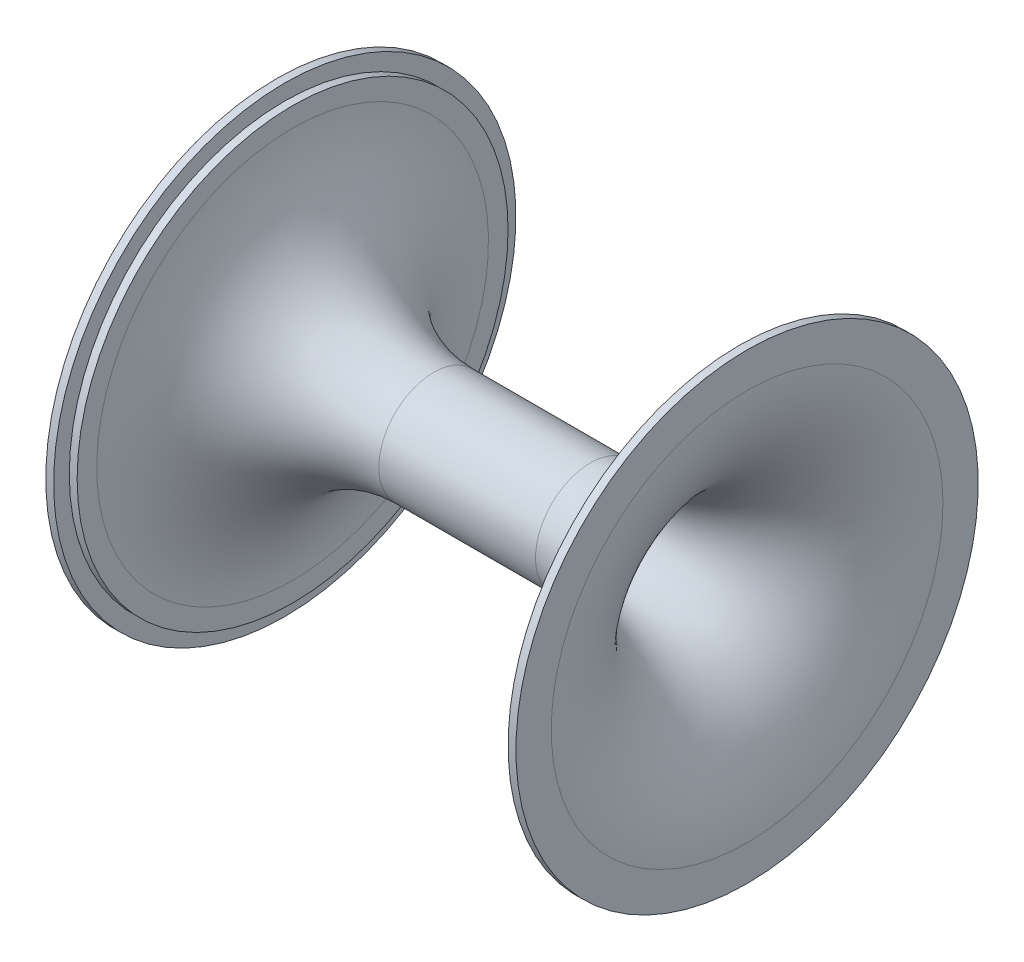
ISO-10303-21;
HEADER;
FILE_DESCRIPTION(('STEP AP214'),'2;1');
FILE_NAME('part.step','',(''),(''),'','','');
FILE_SCHEMA(('AUTOMOTIVE_DESIGN { 1 0 10303 214 1 1 1 1 }'));
ENDSEC;
DATA;
#1=APPLICATION_CONTEXT('core data for automotive mechanical design processes');
#2=APPLICATION_PROTOCOL_DEFINITION('international standard','automotive_design',2000,#1);
#3=PRODUCT_CONTEXT('',#1,'mechanical');
#4=PRODUCT('Part','Part','',(#3));
#5=PRODUCT_RELATED_PRODUCT_CATEGORY('part','',(#4));
#6=PRODUCT_DEFINITION_FORMATION('','',#4);
#7=PRODUCT_DEFINITION_CONTEXT('part definition',#1,'design');
#8=PRODUCT_DEFINITION('design','',#6,#7);
#9=PRODUCT_DEFINITION_SHAPE('','',#8);
#10=(LENGTH_UNIT() NAMED_UNIT(*) SI_UNIT(.MILLI.,.METRE.));
#11=(NAMED_UNIT(*) PLANE_ANGLE_UNIT() SI_UNIT($,.RADIAN.));
#12=(NAMED_UNIT(*) SI_UNIT($,.STERADIAN.) SOLID_ANGLE_UNIT());
#13=UNCERTAINTY_MEASURE_WITH_UNIT(LENGTH_MEASURE(1.E-05),#10,'distance_accuracy_value','');
#14=(GEOMETRIC_REPRESENTATION_CONTEXT(3) GLOBAL_UNCERTAINTY_ASSIGNED_CONTEXT((#13)) GLOBAL_UNIT_ASSIGNED_CONTEXT((#10,
#11,#12)) REPRESENTATION_CONTEXT('',''));
#15=CARTESIAN_POINT('',(0.,0.,0.));
#16=DIRECTION('',(0.,0.,1.));
#17=DIRECTION('',(1.,0.,0.));
#18=AXIS2_PLACEMENT_3D('',#15,#16,#17);
#19=CARTESIAN_POINT('',(-103.792378726126,96.9392817679558,0.));
#20=DIRECTION('',(-1.,0.,0.));
#21=DIRECTION('',(0.,-1.,0.));
#22=AXIS2_PLACEMENT_3D('',#19,#20,#21);
#23=CYLINDRICAL_SURFACE('',#22,55.);
#24=CARTESIAN_POINT('',(-101.792378726126,96.9392817679558,0.));
#25=DIRECTION('',(1.,0.,0.));
#26=DIRECTION('',(0.,0.,-1.));
#27=AXIS2_PLACEMENT_3D('',#24,#25,#26);
#28=CIRCLE('',#27,55.);
#29=CARTESIAN_POINT('',(-101.792378726126,151.939281767956,0.));
#30=VERTEX_POINT('',#29);
#31=EDGE_CURVE('E11',#30,#30,#28,.F.);
#32=ORIENTED_EDGE('',*,*,#31,.F.);
#33=EDGE_LOOP('',(#32));
#34=FACE_BOUND('',#33,.T.);
#35=CARTESIAN_POINT('',(-99.7923787261258,96.9392817679558,0.));
#36=DIRECTION('',(1.,0.,0.));
#37=DIRECTION('',(0.,1.,0.));
#38=AXIS2_PLACEMENT_3D('',#35,#36,#37);
#39=CIRCLE('',#38,55.);
#40=CARTESIAN_POINT('',(-99.7923787261258,151.939281767956,0.));
#41=VERTEX_POINT('',#40);
#42=EDGE_CURVE('E113',#41,#41,#39,.T.);
#43=ORIENTED_EDGE('',*,*,#42,.F.);
#44=EDGE_LOOP('',(#43));
#45=FACE_BOUND('',#44,.T.);
#46=ADVANCED_FACE('F43',(#34,#45),#23,.T.);
#47=CARTESIAN_POINT('',(14.2076212738741,96.9392817679558,0.));
#48=DIRECTION('',(-1.,0.,0.));
#49=DIRECTION('',(0.,0.,1.));
#50=AXIS2_PLACEMENT_3D('',#47,#48,#49);
#51=CIRCLE('',#50,55.);
#52=CARTESIAN_POINT('',(14.2076212738741,151.939281767956,0.));
#53=VERTEX_POINT('',#52);
#54=EDGE_CURVE('E51',#53,#53,#51,.F.);
#55=ORIENTED_EDGE('',*,*,#54,.F.);
#56=EDGE_LOOP('',(#55));
#57=FACE_BOUND('',#56,.T.);
#58=CARTESIAN_POINT('',(12.2076212738741,96.9392817679558,0.));
#59=DIRECTION('',(1.,0.,0.));
#60=DIRECTION('',(0.,0.,-1.));
#61=AXIS2_PLACEMENT_3D('',#58,#59,#60);
#62=CIRCLE('',#61,55.);
#63=CARTESIAN_POINT('',(12.2076212738741,96.9392817679558,-55.));
#64=VERTEX_POINT('',#63);
#65=EDGE_CURVE('E106',#64,#64,#62,.T.);
#66=ORIENTED_EDGE('',*,*,#65,.T.);
#67=EDGE_LOOP('',(#66));
#68=FACE_BOUND('',#67,.T.);
#69=ADVANCED_FACE('F143',(#57,#68),#23,.T.);
#70=CARTESIAN_POINT('',(-99.7923787261258,156.939281767956,150.));
#71=DIRECTION('',(1.,0.,0.));
#72=DIRECTION('',(0.,1.,0.));
#73=AXIS2_PLACEMENT_3D('',#70,#71,#72);
#74=PLANE('',#73);
#75=CARTESIAN_POINT('',(-99.7923787261258,96.9392817679558,0.));
#76=DIRECTION('',(1.,0.,0.));
#77=DIRECTION('',(0.,1.,0.));
#78=AXIS2_PLACEMENT_3D('',#75,#76,#77);
#79=CIRCLE('',#78,50.);
#80=CARTESIAN_POINT('',(-99.7923787261258,146.939281767956,0.));
#81=VERTEX_POINT('',#80);
#82=EDGE_CURVE('E122',#81,#81,#79,.T.);
#83=ORIENTED_EDGE('',*,*,#82,.F.);
#84=EDGE_LOOP('',(#83));
#85=FACE_BOUND('',#84,.T.);
#86=ORIENTED_EDGE('',*,*,#42,.T.);
#87=EDGE_LOOP('',(#86));
#88=FACE_BOUND('',#87,.T.);
#89=ADVANCED_FACE('F146',(#85,#88),#74,.T.);
#90=CARTESIAN_POINT('',(12.2076212738741,156.939281767956,150.));
#91=DIRECTION('',(1.,0.,0.));
#92=DIRECTION('',(0.,0.,-1.));
#93=AXIS2_PLACEMENT_3D('',#90,#91,#92);
#94=PLANE('',#93);
#95=CARTESIAN_POINT('',(12.2076212738741,96.9392817679558,0.));
#96=DIRECTION('',(1.,0.,0.));
#97=DIRECTION('',(0.,0.,-1.));
#98=AXIS2_PLACEMENT_3D('',#95,#96,#97);
#99=CIRCLE('',#98,50.);
#100=CARTESIAN_POINT('',(12.2076212738741,96.9392817679558,-50.));
#101=VERTEX_POINT('',#100);
#102=EDGE_CURVE('E125',#101,#101,#99,.F.);
#103=ORIENTED_EDGE('',*,*,#102,.F.);
#104=EDGE_LOOP('',(#103));
#105=FACE_BOUND('',#104,.T.);
#106=ORIENTED_EDGE('',*,*,#65,.F.);
#107=EDGE_LOOP('',(#106));
#108=FACE_BOUND('',#107,.T.);
#109=ADVANCED_FACE('F151',(#105,#108),#94,.F.);
#110=CARTESIAN_POINT('',(-63.7923787261258,96.9392817679558,0.));
#111=DIRECTION('',(-1.,0.,0.));
#112=DIRECTION('',(0.,0.,1.));
#113=AXIS2_PLACEMENT_3D('',#110,#111,#112);
#114=CYLINDRICAL_SURFACE('',#113,14.);
#115=CARTESIAN_POINT('',(-23.7923787261259,96.9392817679558,0.));
#116=DIRECTION('',(1.,0.,0.));
#117=DIRECTION('',(0.,0.,-1.));
#118=AXIS2_PLACEMENT_3D('',#115,#116,#117);
#119=CIRCLE('',#118,14.);
#120=CARTESIAN_POINT('',(-23.7923787261259,96.9392817679558,-14.));
#121=VERTEX_POINT('',#120);
#122=EDGE_CURVE('E128',#121,#121,#119,.T.);
#123=ORIENTED_EDGE('',*,*,#122,.F.);
#124=EDGE_LOOP('',(#123));
#125=FACE_BOUND('',#124,.T.);
#126=CARTESIAN_POINT('',(-63.7923787261258,96.9392817679558,0.));
#127=DIRECTION('',(1.,0.,0.));
#128=DIRECTION('',(0.,1.,0.));
#129=AXIS2_PLACEMENT_3D('',#126,#127,#128);
#130=CIRCLE('',#129,14.);
#131=CARTESIAN_POINT('',(-63.7923787261258,110.939281767956,0.));
#132=VERTEX_POINT('',#131);
#133=EDGE_CURVE('E131',#132,#132,#130,.F.);
#134=ORIENTED_EDGE('',*,*,#133,.F.);
#135=EDGE_LOOP('',(#134));
#136=FACE_BOUND('',#135,.T.);
#137=ADVANCED_FACE('F153',(#125,#136),#114,.T.);
#138=CARTESIAN_POINT('',(-23.7923787261259,96.9392817679558,0.));
#139=DIRECTION('',(1.,0.,0.));
#140=DIRECTION('',(0.,0.,-1.));
#141=AXIS2_PLACEMENT_3D('',#138,#139,#140);
#142=TOROIDAL_SURFACE('',#141,50.,36.);
#143=ORIENTED_EDGE('',*,*,#102,.T.);
#144=EDGE_LOOP('',(#143));
#145=FACE_BOUND('',#144,.T.);
#146=ORIENTED_EDGE('',*,*,#122,.T.);
#147=EDGE_LOOP('',(#146));
#148=FACE_BOUND('',#147,.T.);
#149=ADVANCED_FACE('F160',(#145,#148),#142,.F.);
#150=CARTESIAN_POINT('',(-63.7923787261258,96.9392817679558,0.));
#151=DIRECTION('',(1.,0.,0.));
#152=DIRECTION('',(0.,1.,0.));
#153=AXIS2_PLACEMENT_3D('',#150,#151,#152);
#154=TOROIDAL_SURFACE('',#153,50.,36.);
#155=ORIENTED_EDGE('',*,*,#82,.T.);
#156=EDGE_LOOP('',(#155));
#157=FACE_BOUND('',#156,.T.);
#158=ORIENTED_EDGE('',*,*,#133,.T.);
#159=EDGE_LOOP('',(#158));
#160=FACE_BOUND('',#159,.T.);
#161=ADVANCED_FACE('F207',(#157,#160),#154,.F.);
#162=CARTESIAN_POINT('',(-63.7923787261258,96.9392817679558,0.));
#163=DIRECTION('',(-1.,0.,0.));
#164=DIRECTION('',(0.,0.,1.));
#165=AXIS2_PLACEMENT_3D('',#162,#163,#164);
#166=CYLINDRICAL_SURFACE('',#165,10.);
#167=CARTESIAN_POINT('',(-63.7923787261258,96.9392817679558,0.));
#168=DIRECTION('',(1.,0.,0.));
#169=DIRECTION('',(0.,1.,0.));
#170=AXIS2_PLACEMENT_3D('',#167,#168,#169);
#171=CIRCLE('',#170,10.);
#172=CARTESIAN_POINT('',(-63.7923787261258,106.939281767956,0.));
#173=VERTEX_POINT('',#172);
#174=EDGE_CURVE('E112',#173,#173,#171,.F.);
#175=ORIENTED_EDGE('',*,*,#174,.T.);
#176=EDGE_LOOP('',(#175));
#177=FACE_BOUND('',#176,.T.);
#178=CARTESIAN_POINT('',(-23.7923787261259,96.9392817679558,0.));
#179=DIRECTION('',(1.,0.,0.));
#180=DIRECTION('',(0.,0.,-1.));
#181=AXIS2_PLACEMENT_3D('',#178,#179,#180);
#182=CIRCLE('',#181,10.);
#183=CARTESIAN_POINT('',(-23.7923787261259,96.9392817679558,-10.));
#184=VERTEX_POINT('',#183);
#185=EDGE_CURVE('E116',#184,#184,#182,.T.);
#186=ORIENTED_EDGE('',*,*,#185,.T.);
#187=EDGE_LOOP('',(#186));
#188=FACE_BOUND('',#187,.T.);
#189=ADVANCED_FACE('F202',(#177,#188),#166,.F.);
#190=CARTESIAN_POINT('',(-23.7923787261259,96.9392817679558,0.));
#191=DIRECTION('',(1.,0.,0.));
#192=DIRECTION('',(0.,0.,-1.));
#193=AXIS2_PLACEMENT_3D('',#190,#191,#192);
#194=TOROIDAL_SURFACE('',#193,50.,40.);
#195=CARTESIAN_POINT('',(16.2076212738741,96.9392817679558,0.));
#196=DIRECTION('',(1.,0.,0.));
#197=DIRECTION('',(0.,0.,-1.));
#198=AXIS2_PLACEMENT_3D('',#195,#196,#197);
#199=CIRCLE('',#198,50.);
#200=CARTESIAN_POINT('',(16.2076212738741,96.9392817679558,-50.));
#201=VERTEX_POINT('',#200);
#202=EDGE_CURVE('E109',#201,#201,#199,.F.);
#203=ORIENTED_EDGE('',*,*,#202,.F.);
#204=EDGE_LOOP('',(#203));
#205=FACE_BOUND('',#204,.T.);
#206=ORIENTED_EDGE('',*,*,#185,.F.);
#207=EDGE_LOOP('',(#206));
#208=FACE_BOUND('',#207,.T.);
#209=ADVANCED_FACE('F200',(#205,#208),#194,.T.);
#210=CARTESIAN_POINT('',(16.2076212738741,156.939281767956,150.));
#211=DIRECTION('',(1.,0.,0.));
#212=DIRECTION('',(0.,0.,-1.));
#213=AXIS2_PLACEMENT_3D('',#210,#211,#212);
#214=PLANE('',#213);
#215=ORIENTED_EDGE('',*,*,#202,.T.);
#216=EDGE_LOOP('',(#215));
#217=FACE_BOUND('',#216,.T.);
#218=CARTESIAN_POINT('',(16.2076212738741,96.9392817679558,0.));
#219=DIRECTION('',(1.,0.,0.));
#220=DIRECTION('',(0.,1.,0.));
#221=AXIS2_PLACEMENT_3D('',#218,#219,#220);
#222=CIRCLE('',#221,59.);
#223=CARTESIAN_POINT('',(16.2076212738741,155.939281767956,0.));
#224=VERTEX_POINT('',#223);
#225=EDGE_CURVE('E60',#224,#224,#222,.T.);
#226=ORIENTED_EDGE('',*,*,#225,.T.);
#227=EDGE_LOOP('',(#226));
#228=FACE_BOUND('',#227,.T.);
#229=ADVANCED_FACE('F45',(#217,#228),#214,.T.);
#230=CARTESIAN_POINT('',(-63.7923787261258,96.9392817679558,0.));
#231=DIRECTION('',(1.,0.,0.));
#232=DIRECTION('',(0.,1.,0.));
#233=AXIS2_PLACEMENT_3D('',#230,#231,#232);
#234=TOROIDAL_SURFACE('',#233,50.,40.);
#235=CARTESIAN_POINT('',(-103.792378726126,96.9392817679558,0.));
#236=DIRECTION('',(1.,0.,0.));
#237=DIRECTION('',(0.,1.,0.));
#238=AXIS2_PLACEMENT_3D('',#235,#236,#237);
#239=CIRCLE('',#238,50.);
#240=CARTESIAN_POINT('',(-103.792378726126,146.939281767956,0.));
#241=VERTEX_POINT('',#240);
#242=EDGE_CURVE('E119',#241,#241,#239,.T.);
#243=ORIENTED_EDGE('',*,*,#242,.F.);
#244=EDGE_LOOP('',(#243));
#245=FACE_BOUND('',#244,.T.);
#246=ORIENTED_EDGE('',*,*,#174,.F.);
#247=EDGE_LOOP('',(#246));
#248=FACE_BOUND('',#247,.T.);
#249=ADVANCED_FACE('F169',(#245,#248),#234,.T.);
#250=CARTESIAN_POINT('',(-103.792378726126,156.939281767956,150.));
#251=DIRECTION('',(1.,0.,0.));
#252=DIRECTION('',(0.,1.,0.));
#253=AXIS2_PLACEMENT_3D('',#250,#251,#252);
#254=PLANE('',#253);
#255=ORIENTED_EDGE('',*,*,#242,.T.);
#256=EDGE_LOOP('',(#255));
#257=FACE_BOUND('',#256,.T.);
#258=CARTESIAN_POINT('',(-103.792378726126,96.9392817679558,0.));
#259=DIRECTION('',(1.,0.,0.));
#260=DIRECTION('',(0.,1.,0.));
#261=AXIS2_PLACEMENT_3D('',#258,#259,#260);
#262=CIRCLE('',#261,59.);
#263=CARTESIAN_POINT('',(-103.792378726126,155.939281767956,0.));
#264=VERTEX_POINT('',#263);
#265=EDGE_CURVE('E82',#264,#264,#262,.T.);
#266=ORIENTED_EDGE('',*,*,#265,.F.);
#267=EDGE_LOOP('',(#266));
#268=FACE_BOUND('',#267,.T.);
#269=ADVANCED_FACE('F167',(#257,#268),#254,.F.);
#270=CARTESIAN_POINT('',(16.2076212738741,96.9392817679558,0.));
#271=DIRECTION('',(1.,0.,0.));
#272=DIRECTION('',(0.,0.,-1.));
#273=AXIS2_PLACEMENT_3D('',#270,#271,#272);
#274=CYLINDRICAL_SURFACE('',#273,59.);
#275=DIRECTION('',(-1.,0.,0.));
#276=VECTOR('',#275,1.);
#277=CARTESIAN_POINT('',(14.2076212738741,155.939281767956,0.));
#278=LINE('',#277,#276);
#279=CARTESIAN_POINT('',(14.2076212738741,155.939281767956,0.));
#280=VERTEX_POINT('',#279);
#281=EDGE_CURVE('E103',#224,#280,#278,.T.);
#282=ORIENTED_EDGE('',*,*,#281,.F.);
#283=ORIENTED_EDGE('',*,*,#225,.F.);
#284=ORIENTED_EDGE('',*,*,#281,.T.);
#285=CARTESIAN_POINT('',(14.2076212738741,96.9392817679558,0.));
#286=DIRECTION('',(1.,0.,0.));
#287=DIRECTION('',(0.,1.,0.));
#288=AXIS2_PLACEMENT_3D('',#285,#286,#287);
#289=CIRCLE('',#288,59.);
#290=EDGE_CURVE('E101',#280,#280,#289,.T.);
#291=ORIENTED_EDGE('',*,*,#290,.T.);
#292=EDGE_LOOP('',(#282,#283,#284,#291));
#293=FACE_BOUND('',#292,.T.);
#294=ADVANCED_FACE('F148',(#293),#274,.T.);
#295=CARTESIAN_POINT('',(14.2076212738741,151.939281767956,0.));
#296=DIRECTION('',(-1.,0.,0.));
#297=DIRECTION('',(0.,0.,1.));
#298=AXIS2_PLACEMENT_3D('',#295,#296,#297);
#299=PLANE('',#298);
#300=ORIENTED_EDGE('',*,*,#54,.T.);
#301=EDGE_LOOP('',(#300));
#302=FACE_BOUND('',#301,.T.);
#303=ORIENTED_EDGE('',*,*,#290,.F.);
#304=EDGE_LOOP('',(#303));
#305=FACE_BOUND('',#304,.T.);
#306=ADVANCED_FACE('F140',(#302,#305),#299,.T.);
#307=CARTESIAN_POINT('',(-103.792378726126,96.9392817679558,0.));
#308=DIRECTION('',(1.,0.,0.));
#309=DIRECTION('',(0.,0.,-1.));
#310=AXIS2_PLACEMENT_3D('',#307,#308,#309);
#311=CYLINDRICAL_SURFACE('',#310,59.);
#312=DIRECTION('',(1.,0.,0.));
#313=VECTOR('',#312,1.);
#314=CARTESIAN_POINT('',(-101.792378726126,155.939281767956,0.));
#315=LINE('',#314,#313);
#316=CARTESIAN_POINT('',(-101.792378726126,155.939281767956,0.));
#317=VERTEX_POINT('',#316);
#318=EDGE_CURVE('E85',#317,#264,#315,.F.);
#319=ORIENTED_EDGE('',*,*,#318,.F.);
#320=CARTESIAN_POINT('',(-101.792378726126,96.9392817679558,0.));
#321=DIRECTION('',(1.,0.,0.));
#322=DIRECTION('',(0.,1.,0.));
#323=AXIS2_PLACEMENT_3D('',#320,#321,#322);
#324=CIRCLE('',#323,59.);
#325=EDGE_CURVE('E89',#317,#317,#324,.T.);
#326=ORIENTED_EDGE('',*,*,#325,.F.);
#327=ORIENTED_EDGE('',*,*,#318,.T.);
#328=ORIENTED_EDGE('',*,*,#265,.T.);
#329=EDGE_LOOP('',(#319,#326,#327,#328));
#330=FACE_BOUND('',#329,.T.);
#331=ADVANCED_FACE('F83',(#330),#311,.T.);
#332=CARTESIAN_POINT('',(-101.792378726126,151.939281767956,0.));
#333=DIRECTION('',(1.,0.,0.));
#334=DIRECTION('',(0.,0.,-1.));
#335=AXIS2_PLACEMENT_3D('',#332,#333,#334);
#336=PLANE('',#335);
#337=ORIENTED_EDGE('',*,*,#325,.T.);
#338=EDGE_LOOP('',(#337));
#339=FACE_BOUND('',#338,.T.);
#340=ORIENTED_EDGE('',*,*,#31,.T.);
#341=EDGE_LOOP('',(#340));
#342=FACE_BOUND('',#341,.T.);
#343=ADVANCED_FACE('F190',(#339,#342),#336,.T.);
#344=CLOSED_SHELL('',(#46,#69,#89,#109,#137,#149,#161,#189,#209,#229,#249,#269,#294,#306,#331,#343));
#345=MANIFOLD_SOLID_BREP('B2',#344);
#346=ADVANCED_BREP_SHAPE_REPRESENTATION('',(#18,#345),#14);
#347=SHAPE_DEFINITION_REPRESENTATION(#9,#346);
ENDSEC;
END-ISO-10303-21;
